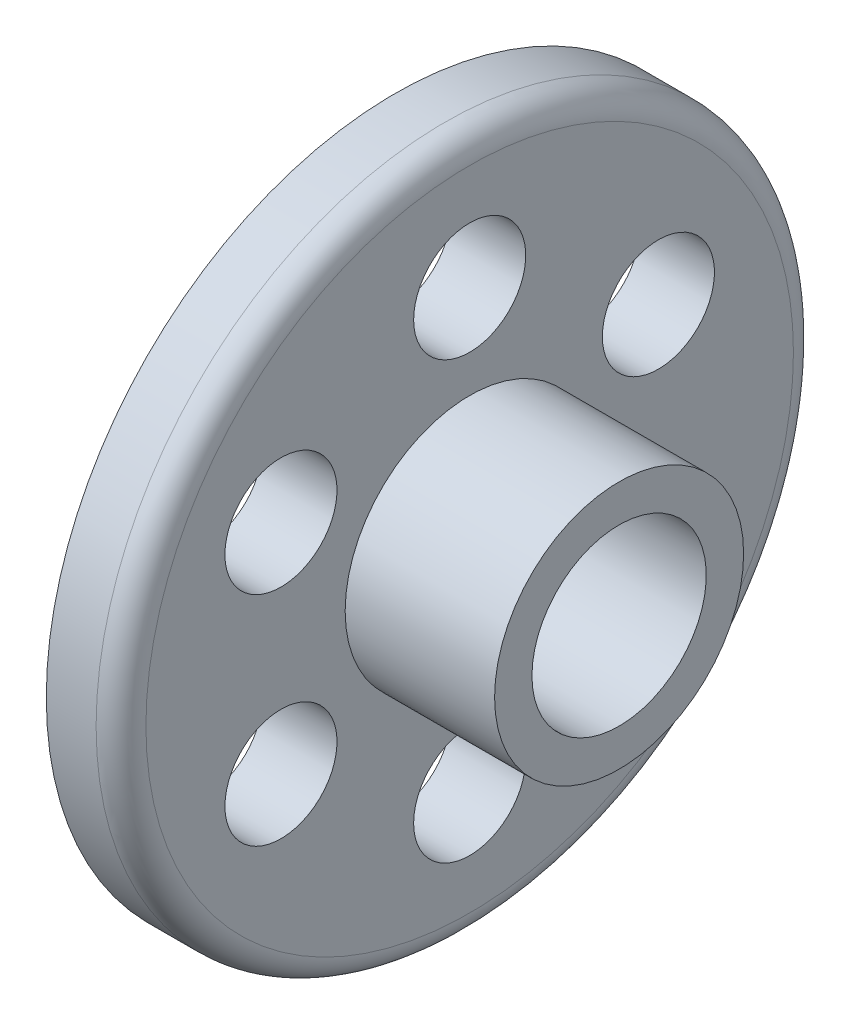
ISO-10303-21;
HEADER;
FILE_DESCRIPTION(('STEP AP214'),'2;1');
FILE_NAME('part.step','',(''),(''),'','','');
FILE_SCHEMA(('AUTOMOTIVE_DESIGN { 1 0 10303 214 1 1 1 1 }'));
ENDSEC;
DATA;
#1=APPLICATION_CONTEXT('core data for automotive mechanical design processes');
#2=APPLICATION_PROTOCOL_DEFINITION('international standard','automotive_design',2000,#1);
#3=PRODUCT_CONTEXT('',#1,'mechanical');
#4=PRODUCT('Part','Part','',(#3));
#5=PRODUCT_RELATED_PRODUCT_CATEGORY('part','',(#4));
#6=PRODUCT_DEFINITION_FORMATION('','',#4);
#7=PRODUCT_DEFINITION_CONTEXT('part definition',#1,'design');
#8=PRODUCT_DEFINITION('design','',#6,#7);
#9=PRODUCT_DEFINITION_SHAPE('','',#8);
#10=(LENGTH_UNIT() NAMED_UNIT(*) SI_UNIT(.MILLI.,.METRE.));
#11=(NAMED_UNIT(*) PLANE_ANGLE_UNIT() SI_UNIT($,.RADIAN.));
#12=(NAMED_UNIT(*) SI_UNIT($,.STERADIAN.) SOLID_ANGLE_UNIT());
#13=UNCERTAINTY_MEASURE_WITH_UNIT(LENGTH_MEASURE(1.E-05),#10,'distance_accuracy_value','');
#14=(GEOMETRIC_REPRESENTATION_CONTEXT(3) GLOBAL_UNCERTAINTY_ASSIGNED_CONTEXT((#13)) GLOBAL_UNIT_ASSIGNED_CONTEXT((#10,
#11,#12)) REPRESENTATION_CONTEXT('',''));
#15=CARTESIAN_POINT('',(0.,0.,0.));
#16=DIRECTION('',(0.,0.,1.));
#17=DIRECTION('',(1.,0.,0.));
#18=AXIS2_PLACEMENT_3D('',#15,#16,#17);
#19=CARTESIAN_POINT('',(0.,0.,0.));
#20=DIRECTION('',(-1.,0.,0.));
#21=DIRECTION('',(0.,0.,1.));
#22=AXIS2_PLACEMENT_3D('',#19,#20,#21);
#23=CYLINDRICAL_SURFACE('',#22,5.);
#24=CARTESIAN_POINT('',(3.,0.,0.));
#25=DIRECTION('',(-1.,0.,0.));
#26=DIRECTION('',(0.,0.,1.));
#27=AXIS2_PLACEMENT_3D('',#24,#25,#26);
#28=CIRCLE('',#27,5.);
#29=CARTESIAN_POINT('',(3.,0.,5.));
#30=VERTEX_POINT('',#29);
#31=EDGE_CURVE('E121',#30,#30,#28,.F.);
#32=ORIENTED_EDGE('',*,*,#31,.T.);
#33=EDGE_LOOP('',(#32));
#34=FACE_BOUND('',#33,.T.);
#35=CARTESIAN_POINT('',(9.,0.,0.));
#36=DIRECTION('',(-1.,0.,0.));
#37=DIRECTION('',(0.,0.,1.));
#38=AXIS2_PLACEMENT_3D('',#35,#36,#37);
#39=CIRCLE('',#38,5.);
#40=CARTESIAN_POINT('',(9.,0.,5.));
#41=VERTEX_POINT('',#40);
#42=EDGE_CURVE('E46',#41,#41,#39,.T.);
#43=ORIENTED_EDGE('',*,*,#42,.T.);
#44=EDGE_LOOP('',(#43));
#45=FACE_BOUND('',#44,.T.);
#46=ADVANCED_FACE('F17',(#34,#45),#23,.T.);
#47=CARTESIAN_POINT('',(3.,13.,0.));
#48=DIRECTION('',(-1.,0.,0.));
#49=DIRECTION('',(0.,0.,1.));
#50=AXIS2_PLACEMENT_3D('',#47,#48,#49);
#51=PLANE('',#50);
#52=ORIENTED_EDGE('',*,*,#31,.F.);
#53=EDGE_LOOP('',(#52));
#54=FACE_BOUND('',#53,.T.);
#55=CARTESIAN_POINT('',(3.,0.,0.));
#56=DIRECTION('',(-1.,0.,0.));
#57=DIRECTION('',(0.,0.,-1.));
#58=AXIS2_PLACEMENT_3D('',#55,#56,#57);
#59=CIRCLE('',#58,13.);
#60=CARTESIAN_POINT('',(3.,0.,-13.));
#61=VERTEX_POINT('',#60);
#62=CARTESIAN_POINT('',(3.,0.,13.));
#63=VERTEX_POINT('',#62);
#64=EDGE_CURVE('E41',#61,#63,#59,.T.);
#65=ORIENTED_EDGE('',*,*,#64,.F.);
#66=CARTESIAN_POINT('',(3.,0.,0.));
#67=DIRECTION('',(-1.,0.,0.));
#68=DIRECTION('',(0.,0.,1.));
#69=AXIS2_PLACEMENT_3D('',#66,#67,#68);
#70=CIRCLE('',#69,13.);
#71=EDGE_CURVE('E38',#63,#61,#70,.T.);
#72=ORIENTED_EDGE('',*,*,#71,.F.);
#73=EDGE_LOOP('',(#65,#72));
#74=FACE_BOUND('',#73,.T.);
#75=CARTESIAN_POINT('',(3.,8.75,0.));
#76=DIRECTION('',(-1.,0.,0.));
#77=DIRECTION('',(0.,0.,1.));
#78=AXIS2_PLACEMENT_3D('',#75,#76,#77);
#79=CIRCLE('',#78,2.25);
#80=CARTESIAN_POINT('',(3.,8.75,2.25));
#81=VERTEX_POINT('',#80);
#82=EDGE_CURVE('E96',#81,#81,#79,.T.);
#83=ORIENTED_EDGE('',*,*,#82,.T.);
#84=EDGE_LOOP('',(#83));
#85=FACE_BOUND('',#84,.T.);
#86=CARTESIAN_POINT('',(3.,4.37499999999998,-7.57772228311385));
#87=DIRECTION('',(-1.,0.,0.));
#88=DIRECTION('',(0.,0.,1.));
#89=AXIS2_PLACEMENT_3D('',#86,#87,#88);
#90=CIRCLE('',#89,2.25);
#91=CARTESIAN_POINT('',(3.,4.37499999999998,-5.32772228311385));
#92=VERTEX_POINT('',#91);
#93=EDGE_CURVE('E100',#92,#92,#90,.T.);
#94=ORIENTED_EDGE('',*,*,#93,.T.);
#95=EDGE_LOOP('',(#94));
#96=FACE_BOUND('',#95,.T.);
#97=CARTESIAN_POINT('',(3.,-4.37500000000004,-7.57772228311382));
#98=DIRECTION('',(-1.,0.,0.));
#99=DIRECTION('',(0.,0.,1.));
#100=AXIS2_PLACEMENT_3D('',#97,#98,#99);
#101=CIRCLE('',#100,2.25);
#102=CARTESIAN_POINT('',(3.,-4.37500000000004,-5.32772228311382));
#103=VERTEX_POINT('',#102);
#104=EDGE_CURVE('E107',#103,#103,#101,.T.);
#105=ORIENTED_EDGE('',*,*,#104,.T.);
#106=EDGE_LOOP('',(#105));
#107=FACE_BOUND('',#106,.T.);
#108=CARTESIAN_POINT('',(3.,-8.75,0.));
#109=DIRECTION('',(-1.,0.,0.));
#110=DIRECTION('',(0.,0.,1.));
#111=AXIS2_PLACEMENT_3D('',#108,#109,#110);
#112=CIRCLE('',#111,2.25);
#113=CARTESIAN_POINT('',(3.,-8.75,2.25));
#114=VERTEX_POINT('',#113);
#115=EDGE_CURVE('E111',#114,#114,#112,.T.);
#116=ORIENTED_EDGE('',*,*,#115,.T.);
#117=EDGE_LOOP('',(#116));
#118=FACE_BOUND('',#117,.T.);
#119=CARTESIAN_POINT('',(3.,-4.37499999999993,7.57772228311388));
#120=DIRECTION('',(-1.,0.,0.));
#121=DIRECTION('',(0.,0.,1.));
#122=AXIS2_PLACEMENT_3D('',#119,#120,#121);
#123=CIRCLE('',#122,2.25);
#124=CARTESIAN_POINT('',(3.,-4.37499999999993,9.82772228311388));
#125=VERTEX_POINT('',#124);
#126=EDGE_CURVE('E114',#125,#125,#123,.T.);
#127=ORIENTED_EDGE('',*,*,#126,.T.);
#128=EDGE_LOOP('',(#127));
#129=FACE_BOUND('',#128,.T.);
#130=CARTESIAN_POINT('',(3.,4.37500000000009,7.57772228311379));
#131=DIRECTION('',(-1.,0.,0.));
#132=DIRECTION('',(0.,0.,1.));
#133=AXIS2_PLACEMENT_3D('',#130,#131,#132);
#134=CIRCLE('',#133,2.25);
#135=CARTESIAN_POINT('',(3.,4.37500000000009,9.82772228311379));
#136=VERTEX_POINT('',#135);
#137=EDGE_CURVE('E52',#136,#136,#134,.T.);
#138=ORIENTED_EDGE('',*,*,#137,.T.);
#139=EDGE_LOOP('',(#138));
#140=FACE_BOUND('',#139,.T.);
#141=ADVANCED_FACE('F49',(#54,#74,#85,#96,#107,#118,#129,#140),#51,.F.);
#142=CARTESIAN_POINT('',(9.,5.,0.));
#143=DIRECTION('',(-1.,0.,0.));
#144=DIRECTION('',(0.,0.,1.));
#145=AXIS2_PLACEMENT_3D('',#142,#143,#144);
#146=PLANE('',#145);
#147=CARTESIAN_POINT('',(9.,0.,0.));
#148=DIRECTION('',(-1.,0.,0.));
#149=DIRECTION('',(0.,0.,1.));
#150=AXIS2_PLACEMENT_3D('',#147,#148,#149);
#151=CIRCLE('',#150,3.5);
#152=CARTESIAN_POINT('',(9.,0.,3.5));
#153=VERTEX_POINT('',#152);
#154=EDGE_CURVE('E87',#153,#153,#151,.T.);
#155=ORIENTED_EDGE('',*,*,#154,.T.);
#156=EDGE_LOOP('',(#155));
#157=FACE_BOUND('',#156,.T.);
#158=ORIENTED_EDGE('',*,*,#42,.F.);
#159=EDGE_LOOP('',(#158));
#160=FACE_BOUND('',#159,.T.);
#161=ADVANCED_FACE('F68',(#157,#160),#146,.F.);
#162=CARTESIAN_POINT('',(2.,0.,0.));
#163=DIRECTION('',(-1.,0.,0.));
#164=DIRECTION('',(0.,0.,1.));
#165=AXIS2_PLACEMENT_3D('',#162,#163,#164);
#166=TOROIDAL_SURFACE('',#165,13.,1.);
#167=CARTESIAN_POINT('',(1.99999999999999,0.,0.));
#168=DIRECTION('',(-1.,0.,0.));
#169=DIRECTION('',(0.,0.,1.));
#170=AXIS2_PLACEMENT_3D('',#167,#168,#169);
#171=CIRCLE('',#170,14.);
#172=CARTESIAN_POINT('',(1.99999999999999,0.,14.));
#173=VERTEX_POINT('',#172);
#174=EDGE_CURVE('E83',#173,#173,#171,.T.);
#175=ORIENTED_EDGE('',*,*,#174,.F.);
#176=EDGE_LOOP('',(#175));
#177=FACE_BOUND('',#176,.T.);
#178=ORIENTED_EDGE('',*,*,#71,.T.);
#179=ORIENTED_EDGE('',*,*,#64,.T.);
#180=EDGE_LOOP('',(#178,#179));
#181=FACE_BOUND('',#180,.T.);
#182=ADVANCED_FACE('F42',(#177,#181),#166,.T.);
#183=CARTESIAN_POINT('',(9.,4.37500000000009,7.57772228311379));
#184=DIRECTION('',(-1.,0.,0.));
#185=DIRECTION('',(0.,0.,1.));
#186=AXIS2_PLACEMENT_3D('',#183,#184,#185);
#187=CYLINDRICAL_SURFACE('',#186,2.25);
#188=ORIENTED_EDGE('',*,*,#137,.F.);
#189=EDGE_LOOP('',(#188));
#190=FACE_BOUND('',#189,.T.);
#191=CARTESIAN_POINT('',(0.,4.37500000000009,7.57772228311379));
#192=DIRECTION('',(-1.,0.,0.));
#193=DIRECTION('',(0.,0.,1.));
#194=AXIS2_PLACEMENT_3D('',#191,#192,#193);
#195=CIRCLE('',#194,2.25);
#196=CARTESIAN_POINT('',(0.,4.37500000000009,9.82772228311379));
#197=VERTEX_POINT('',#196);
#198=EDGE_CURVE('E86',#197,#197,#195,.T.);
#199=ORIENTED_EDGE('',*,*,#198,.T.);
#200=EDGE_LOOP('',(#199));
#201=FACE_BOUND('',#200,.T.);
#202=ADVANCED_FACE('F77',(#190,#201),#187,.F.);
#203=CARTESIAN_POINT('',(9.,-4.37499999999993,7.57772228311388));
#204=DIRECTION('',(-1.,0.,0.));
#205=DIRECTION('',(0.,0.,1.));
#206=AXIS2_PLACEMENT_3D('',#203,#204,#205);
#207=CYLINDRICAL_SURFACE('',#206,2.25);
#208=ORIENTED_EDGE('',*,*,#126,.F.);
#209=EDGE_LOOP('',(#208));
#210=FACE_BOUND('',#209,.T.);
#211=CARTESIAN_POINT('',(0.,-4.37499999999993,7.57772228311388));
#212=DIRECTION('',(-1.,0.,0.));
#213=DIRECTION('',(0.,0.,1.));
#214=AXIS2_PLACEMENT_3D('',#211,#212,#213);
#215=CIRCLE('',#214,2.25);
#216=CARTESIAN_POINT('',(0.,-4.37499999999993,9.82772228311388));
#217=VERTEX_POINT('',#216);
#218=EDGE_CURVE('E93',#217,#217,#215,.T.);
#219=ORIENTED_EDGE('',*,*,#218,.T.);
#220=EDGE_LOOP('',(#219));
#221=FACE_BOUND('',#220,.T.);
#222=ADVANCED_FACE('F164',(#210,#221),#207,.F.);
#223=CARTESIAN_POINT('',(9.,-8.75,0.));
#224=DIRECTION('',(-1.,0.,0.));
#225=DIRECTION('',(0.,0.,1.));
#226=AXIS2_PLACEMENT_3D('',#223,#224,#225);
#227=CYLINDRICAL_SURFACE('',#226,2.25);
#228=ORIENTED_EDGE('',*,*,#115,.F.);
#229=EDGE_LOOP('',(#228));
#230=FACE_BOUND('',#229,.T.);
#231=CARTESIAN_POINT('',(0.,-8.75,0.));
#232=DIRECTION('',(-1.,0.,0.));
#233=DIRECTION('',(0.,0.,1.));
#234=AXIS2_PLACEMENT_3D('',#231,#232,#233);
#235=CIRCLE('',#234,2.25);
#236=CARTESIAN_POINT('',(0.,-8.75,2.25));
#237=VERTEX_POINT('',#236);
#238=EDGE_CURVE('E177',#237,#237,#235,.T.);
#239=ORIENTED_EDGE('',*,*,#238,.T.);
#240=EDGE_LOOP('',(#239));
#241=FACE_BOUND('',#240,.T.);
#242=ADVANCED_FACE('F161',(#230,#241),#227,.F.);
#243=CARTESIAN_POINT('',(9.,-4.37500000000004,-7.57772228311382));
#244=DIRECTION('',(-1.,0.,0.));
#245=DIRECTION('',(0.,0.,1.));
#246=AXIS2_PLACEMENT_3D('',#243,#244,#245);
#247=CYLINDRICAL_SURFACE('',#246,2.25);
#248=ORIENTED_EDGE('',*,*,#104,.F.);
#249=EDGE_LOOP('',(#248));
#250=FACE_BOUND('',#249,.T.);
#251=CARTESIAN_POINT('',(0.,-4.37500000000004,-7.57772228311382));
#252=DIRECTION('',(-1.,0.,0.));
#253=DIRECTION('',(0.,0.,1.));
#254=AXIS2_PLACEMENT_3D('',#251,#252,#253);
#255=CIRCLE('',#254,2.25);
#256=CARTESIAN_POINT('',(0.,-4.37500000000004,-5.32772228311382));
#257=VERTEX_POINT('',#256);
#258=EDGE_CURVE('E179',#257,#257,#255,.T.);
#259=ORIENTED_EDGE('',*,*,#258,.T.);
#260=EDGE_LOOP('',(#259));
#261=FACE_BOUND('',#260,.T.);
#262=ADVANCED_FACE('F157',(#250,#261),#247,.F.);
#263=CARTESIAN_POINT('',(9.,4.37499999999998,-7.57772228311385));
#264=DIRECTION('',(-1.,0.,0.));
#265=DIRECTION('',(0.,0.,1.));
#266=AXIS2_PLACEMENT_3D('',#263,#264,#265);
#267=CYLINDRICAL_SURFACE('',#266,2.25);
#268=ORIENTED_EDGE('',*,*,#93,.F.);
#269=EDGE_LOOP('',(#268));
#270=FACE_BOUND('',#269,.T.);
#271=CARTESIAN_POINT('',(0.,4.37499999999998,-7.57772228311385));
#272=DIRECTION('',(-1.,0.,0.));
#273=DIRECTION('',(0.,0.,1.));
#274=AXIS2_PLACEMENT_3D('',#271,#272,#273);
#275=CIRCLE('',#274,2.25);
#276=CARTESIAN_POINT('',(0.,4.37499999999998,-5.32772228311385));
#277=VERTEX_POINT('',#276);
#278=EDGE_CURVE('E185',#277,#277,#275,.T.);
#279=ORIENTED_EDGE('',*,*,#278,.T.);
#280=EDGE_LOOP('',(#279));
#281=FACE_BOUND('',#280,.T.);
#282=ADVANCED_FACE('F153',(#270,#281),#267,.F.);
#283=CARTESIAN_POINT('',(9.,8.75,0.));
#284=DIRECTION('',(-1.,0.,0.));
#285=DIRECTION('',(0.,0.,1.));
#286=AXIS2_PLACEMENT_3D('',#283,#284,#285);
#287=CYLINDRICAL_SURFACE('',#286,2.25);
#288=ORIENTED_EDGE('',*,*,#82,.F.);
#289=EDGE_LOOP('',(#288));
#290=FACE_BOUND('',#289,.T.);
#291=CARTESIAN_POINT('',(0.,8.75,0.));
#292=DIRECTION('',(-1.,0.,0.));
#293=DIRECTION('',(0.,0.,1.));
#294=AXIS2_PLACEMENT_3D('',#291,#292,#293);
#295=CIRCLE('',#294,2.25);
#296=CARTESIAN_POINT('',(0.,8.75,2.25));
#297=VERTEX_POINT('',#296);
#298=EDGE_CURVE('E189',#297,#297,#295,.T.);
#299=ORIENTED_EDGE('',*,*,#298,.T.);
#300=EDGE_LOOP('',(#299));
#301=FACE_BOUND('',#300,.T.);
#302=ADVANCED_FACE('F149',(#290,#301),#287,.F.);
#303=CARTESIAN_POINT('',(0.,0.,0.));
#304=DIRECTION('',(-1.,0.,0.));
#305=DIRECTION('',(0.,0.,1.));
#306=AXIS2_PLACEMENT_3D('',#303,#304,#305);
#307=CYLINDRICAL_SURFACE('',#306,3.5);
#308=ORIENTED_EDGE('',*,*,#154,.F.);
#309=EDGE_LOOP('',(#308));
#310=FACE_BOUND('',#309,.T.);
#311=CARTESIAN_POINT('',(0.,0.,0.));
#312=DIRECTION('',(-1.,0.,0.));
#313=DIRECTION('',(0.,0.,1.));
#314=AXIS2_PLACEMENT_3D('',#311,#312,#313);
#315=CIRCLE('',#314,3.5);
#316=CARTESIAN_POINT('',(0.,0.,3.5));
#317=VERTEX_POINT('',#316);
#318=EDGE_CURVE('E28',#317,#317,#315,.T.);
#319=ORIENTED_EDGE('',*,*,#318,.T.);
#320=EDGE_LOOP('',(#319));
#321=FACE_BOUND('',#320,.T.);
#322=ADVANCED_FACE('F141',(#310,#321),#307,.F.);
#323=CARTESIAN_POINT('',(0.,0.,0.));
#324=DIRECTION('',(-1.,0.,0.));
#325=DIRECTION('',(0.,0.,1.));
#326=AXIS2_PLACEMENT_3D('',#323,#324,#325);
#327=CYLINDRICAL_SURFACE('',#326,14.);
#328=CARTESIAN_POINT('',(0.,0.,0.));
#329=DIRECTION('',(-1.,0.,0.));
#330=DIRECTION('',(0.,0.,1.));
#331=AXIS2_PLACEMENT_3D('',#328,#329,#330);
#332=CIRCLE('',#331,14.);
#333=CARTESIAN_POINT('',(0.,0.,14.));
#334=VERTEX_POINT('',#333);
#335=EDGE_CURVE('E11',#334,#334,#332,.F.);
#336=ORIENTED_EDGE('',*,*,#335,.T.);
#337=EDGE_LOOP('',(#336));
#338=FACE_BOUND('',#337,.T.);
#339=ORIENTED_EDGE('',*,*,#174,.T.);
#340=EDGE_LOOP('',(#339));
#341=FACE_BOUND('',#340,.T.);
#342=ADVANCED_FACE('F135',(#338,#341),#327,.T.);
#343=CARTESIAN_POINT('',(0.,14.,0.));
#344=DIRECTION('',(1.,0.,0.));
#345=DIRECTION('',(0.,0.,-1.));
#346=AXIS2_PLACEMENT_3D('',#343,#344,#345);
#347=PLANE('',#346);
#348=ORIENTED_EDGE('',*,*,#335,.F.);
#349=EDGE_LOOP('',(#348));
#350=FACE_BOUND('',#349,.T.);
#351=ORIENTED_EDGE('',*,*,#318,.F.);
#352=EDGE_LOOP('',(#351));
#353=FACE_BOUND('',#352,.T.);
#354=ORIENTED_EDGE('',*,*,#298,.F.);
#355=EDGE_LOOP('',(#354));
#356=FACE_BOUND('',#355,.T.);
#357=ORIENTED_EDGE('',*,*,#278,.F.);
#358=EDGE_LOOP('',(#357));
#359=FACE_BOUND('',#358,.T.);
#360=ORIENTED_EDGE('',*,*,#258,.F.);
#361=EDGE_LOOP('',(#360));
#362=FACE_BOUND('',#361,.T.);
#363=ORIENTED_EDGE('',*,*,#238,.F.);
#364=EDGE_LOOP('',(#363));
#365=FACE_BOUND('',#364,.T.);
#366=ORIENTED_EDGE('',*,*,#218,.F.);
#367=EDGE_LOOP('',(#366));
#368=FACE_BOUND('',#367,.T.);
#369=ORIENTED_EDGE('',*,*,#198,.F.);
#370=EDGE_LOOP('',(#369));
#371=FACE_BOUND('',#370,.T.);
#372=ADVANCED_FACE('F133',(#350,#353,#356,#359,#362,#365,#368,#371),#347,.F.);
#373=CLOSED_SHELL('',(#46,#141,#161,#182,#202,#222,#242,#262,#282,#302,#322,#342,#372));
#374=MANIFOLD_SOLID_BREP('B1',#373);
#375=ADVANCED_BREP_SHAPE_REPRESENTATION('',(#18,#374),#14);
#376=SHAPE_DEFINITION_REPRESENTATION(#9,#375);
ENDSEC;
END-ISO-10303-21;
